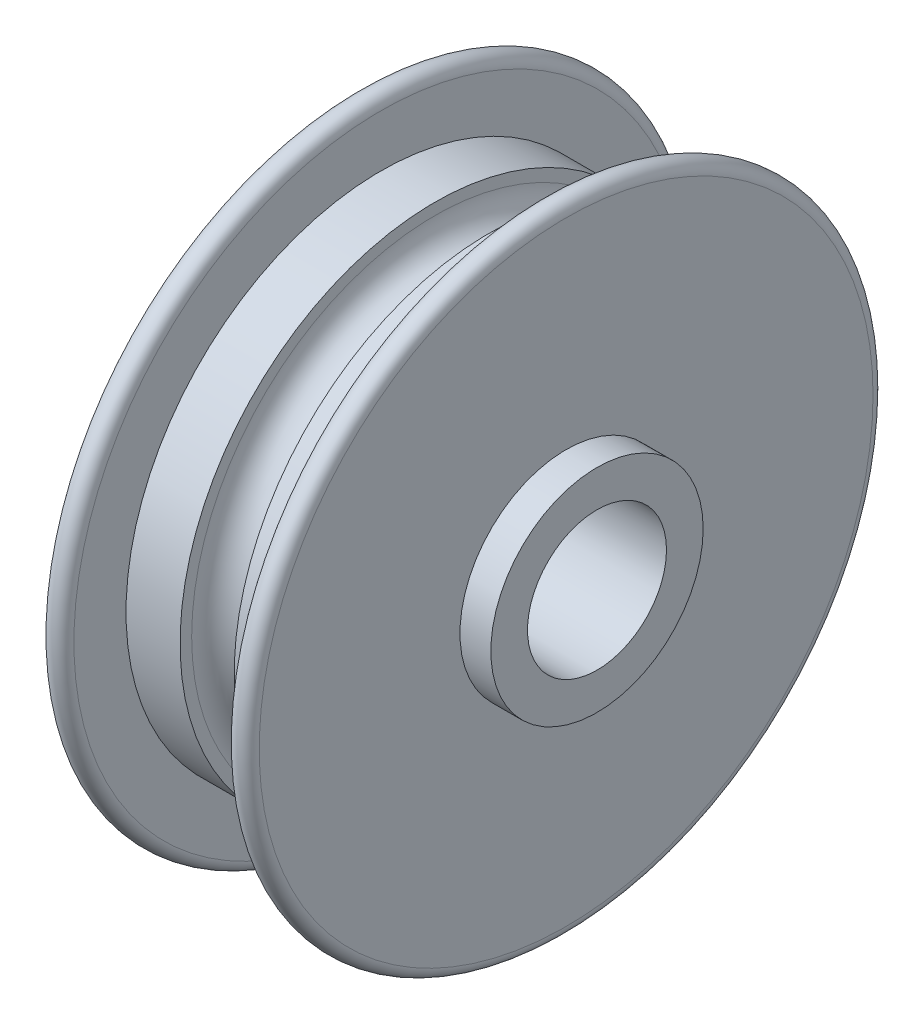
ISO-10303-21;
HEADER;
FILE_DESCRIPTION(('STEP AP214'),'2;1');
FILE_NAME('part.step','',(''),(''),'','','');
FILE_SCHEMA(('AUTOMOTIVE_DESIGN { 1 0 10303 214 1 1 1 1 }'));
ENDSEC;
DATA;
#1=APPLICATION_CONTEXT('core data for automotive mechanical design processes');
#2=APPLICATION_PROTOCOL_DEFINITION('international standard','automotive_design',2000,#1);
#3=PRODUCT_CONTEXT('',#1,'mechanical');
#4=PRODUCT('Part','Part','',(#3));
#5=PRODUCT_RELATED_PRODUCT_CATEGORY('part','',(#4));
#6=PRODUCT_DEFINITION_FORMATION('','',#4);
#7=PRODUCT_DEFINITION_CONTEXT('part definition',#1,'design');
#8=PRODUCT_DEFINITION('design','',#6,#7);
#9=PRODUCT_DEFINITION_SHAPE('','',#8);
#10=(LENGTH_UNIT() NAMED_UNIT(*) SI_UNIT(.MILLI.,.METRE.));
#11=(NAMED_UNIT(*) PLANE_ANGLE_UNIT() SI_UNIT($,.RADIAN.));
#12=(NAMED_UNIT(*) SI_UNIT($,.STERADIAN.) SOLID_ANGLE_UNIT());
#13=UNCERTAINTY_MEASURE_WITH_UNIT(LENGTH_MEASURE(1.E-05),#10,'distance_accuracy_value','');
#14=(GEOMETRIC_REPRESENTATION_CONTEXT(3) GLOBAL_UNCERTAINTY_ASSIGNED_CONTEXT((#13)) GLOBAL_UNIT_ASSIGNED_CONTEXT((#10,
#11,#12)) REPRESENTATION_CONTEXT('',''));
#15=CARTESIAN_POINT('',(0.,0.,0.));
#16=DIRECTION('',(0.,0.,1.));
#17=DIRECTION('',(1.,0.,0.));
#18=AXIS2_PLACEMENT_3D('',#15,#16,#17);
#19=CARTESIAN_POINT('',(-3.32408663179228,0.,0.));
#20=DIRECTION('',(1.,0.,0.));
#21=DIRECTION('',(0.,0.,-1.));
#22=AXIS2_PLACEMENT_3D('',#19,#20,#21);
#23=TOROIDAL_SURFACE('',#22,39.75,1.5);
#24=CARTESIAN_POINT('',(-1.82408663179228,0.,0.));
#25=DIRECTION('',(1.,0.,0.));
#26=DIRECTION('',(0.,0.,-1.));
#27=AXIS2_PLACEMENT_3D('',#24,#25,#26);
#28=CIRCLE('',#27,39.75);
#29=CARTESIAN_POINT('',(-1.82408663179228,0.,-39.75));
#30=VERTEX_POINT('',#29);
#31=EDGE_CURVE('E108',#30,#30,#28,.T.);
#32=ORIENTED_EDGE('',*,*,#31,.F.);
#33=EDGE_LOOP('',(#32));
#34=FACE_BOUND('',#33,.T.);
#35=CARTESIAN_POINT('',(-4.82408663179229,0.,0.));
#36=DIRECTION('',(1.,0.,0.));
#37=DIRECTION('',(0.,0.,-1.));
#38=AXIS2_PLACEMENT_3D('',#35,#36,#37);
#39=CIRCLE('',#38,39.75);
#40=CARTESIAN_POINT('',(-4.82408663179229,0.,-39.75));
#41=VERTEX_POINT('',#40);
#42=EDGE_CURVE('E10',#41,#41,#39,.T.);
#43=ORIENTED_EDGE('',*,*,#42,.T.);
#44=EDGE_LOOP('',(#43));
#45=FACE_BOUND('',#44,.T.);
#46=ADVANCED_FACE('F41',(#34,#45),#23,.T.);
#47=CARTESIAN_POINT('',(-4.82408663179228,0.,0.));
#48=DIRECTION('',(1.,0.,0.));
#49=DIRECTION('',(0.,0.,-1.));
#50=AXIS2_PLACEMENT_3D('',#47,#48,#49);
#51=PLANE('',#50);
#52=ORIENTED_EDGE('',*,*,#42,.F.);
#53=EDGE_LOOP('',(#52));
#54=FACE_BOUND('',#53,.T.);
#55=CARTESIAN_POINT('',(-4.82408663179228,0.,0.));
#56=DIRECTION('',(1.,0.,0.));
#57=DIRECTION('',(0.,0.,-1.));
#58=AXIS2_PLACEMENT_3D('',#55,#56,#57);
#59=CIRCLE('',#58,13.75);
#60=CARTESIAN_POINT('',(-4.82408663179228,0.,-13.75));
#61=VERTEX_POINT('',#60);
#62=EDGE_CURVE('E48',#61,#61,#59,.T.);
#63=ORIENTED_EDGE('',*,*,#62,.T.);
#64=EDGE_LOOP('',(#63));
#65=FACE_BOUND('',#64,.T.);
#66=ADVANCED_FACE('F116',(#54,#65),#51,.F.);
#67=CARTESIAN_POINT('',(-24.4615520047495,0.,0.));
#68=DIRECTION('',(1.,0.,0.));
#69=DIRECTION('',(0.,0.,-1.));
#70=AXIS2_PLACEMENT_3D('',#67,#68,#69);
#71=CYLINDRICAL_SURFACE('',#70,13.75);
#72=ORIENTED_EDGE('',*,*,#62,.F.);
#73=EDGE_LOOP('',(#72));
#74=FACE_BOUND('',#73,.T.);
#75=CARTESIAN_POINT('',(-8.82408663179228,0.,0.));
#76=DIRECTION('',(1.,0.,0.));
#77=DIRECTION('',(0.,0.,-1.));
#78=AXIS2_PLACEMENT_3D('',#75,#76,#77);
#79=CIRCLE('',#78,13.75);
#80=CARTESIAN_POINT('',(-8.82408663179228,0.,-13.75));
#81=VERTEX_POINT('',#80);
#82=EDGE_CURVE('E53',#81,#81,#79,.T.);
#83=ORIENTED_EDGE('',*,*,#82,.T.);
#84=EDGE_LOOP('',(#83));
#85=FACE_BOUND('',#84,.T.);
#86=ADVANCED_FACE('F120',(#74,#85),#71,.T.);
#87=CARTESIAN_POINT('',(-8.82408663179228,0.,0.));
#88=DIRECTION('',(-1.,0.,0.));
#89=DIRECTION('',(0.,0.,1.));
#90=AXIS2_PLACEMENT_3D('',#87,#88,#89);
#91=PLANE('',#90);
#92=CARTESIAN_POINT('',(-8.82408663179228,0.,0.));
#93=DIRECTION('',(1.,0.,0.));
#94=DIRECTION('',(0.,0.,-1.));
#95=AXIS2_PLACEMENT_3D('',#92,#93,#94);
#96=CIRCLE('',#95,8.99999999999999);
#97=CARTESIAN_POINT('',(-8.82408663179228,0.,-8.99999999999999));
#98=VERTEX_POINT('',#97);
#99=EDGE_CURVE('E58',#98,#98,#96,.T.);
#100=ORIENTED_EDGE('',*,*,#99,.T.);
#101=EDGE_LOOP('',(#100));
#102=FACE_BOUND('',#101,.T.);
#103=ORIENTED_EDGE('',*,*,#82,.F.);
#104=EDGE_LOOP('',(#103));
#105=FACE_BOUND('',#104,.T.);
#106=ADVANCED_FACE('F125',(#102,#105),#91,.T.);
#107=CARTESIAN_POINT('',(-24.4615520047495,0.,0.));
#108=DIRECTION('',(1.,0.,0.));
#109=DIRECTION('',(0.,0.,-1.));
#110=AXIS2_PLACEMENT_3D('',#107,#108,#109);
#111=CYLINDRICAL_SURFACE('',#110,9.);
#112=CARTESIAN_POINT('',(26.1759133682077,0.,0.));
#113=DIRECTION('',(1.,0.,0.));
#114=DIRECTION('',(0.,0.,-1.));
#115=AXIS2_PLACEMENT_3D('',#112,#113,#114);
#116=CIRCLE('',#115,9.);
#117=CARTESIAN_POINT('',(26.1759133682077,0.,-9.));
#118=VERTEX_POINT('',#117);
#119=EDGE_CURVE('E64',#118,#118,#116,.T.);
#120=ORIENTED_EDGE('',*,*,#119,.T.);
#121=EDGE_LOOP('',(#120));
#122=FACE_BOUND('',#121,.T.);
#123=ORIENTED_EDGE('',*,*,#99,.F.);
#124=EDGE_LOOP('',(#123));
#125=FACE_BOUND('',#124,.T.);
#126=ADVANCED_FACE('F131',(#122,#125),#111,.F.);
#127=CARTESIAN_POINT('',(26.1759133682077,0.,0.));
#128=DIRECTION('',(-1.,0.,0.));
#129=DIRECTION('',(0.,0.,1.));
#130=AXIS2_PLACEMENT_3D('',#127,#128,#129);
#131=PLANE('',#130);
#132=ORIENTED_EDGE('',*,*,#119,.F.);
#133=EDGE_LOOP('',(#132));
#134=FACE_BOUND('',#133,.T.);
#135=CARTESIAN_POINT('',(26.1759133682077,0.,0.));
#136=DIRECTION('',(1.,0.,0.));
#137=DIRECTION('',(0.,0.,-1.));
#138=AXIS2_PLACEMENT_3D('',#135,#136,#137);
#139=CIRCLE('',#138,13.75);
#140=CARTESIAN_POINT('',(26.1759133682077,0.,-13.75));
#141=VERTEX_POINT('',#140);
#142=EDGE_CURVE('E68',#141,#141,#139,.T.);
#143=ORIENTED_EDGE('',*,*,#142,.T.);
#144=EDGE_LOOP('',(#143));
#145=FACE_BOUND('',#144,.T.);
#146=ADVANCED_FACE('F135',(#134,#145),#131,.F.);
#147=CARTESIAN_POINT('',(-24.4615520047495,0.,0.));
#148=DIRECTION('',(1.,0.,0.));
#149=DIRECTION('',(0.,0.,-1.));
#150=AXIS2_PLACEMENT_3D('',#147,#148,#149);
#151=CYLINDRICAL_SURFACE('',#150,13.75);
#152=CARTESIAN_POINT('',(22.1759133682077,0.,0.));
#153=DIRECTION('',(1.,0.,0.));
#154=DIRECTION('',(0.,0.,-1.));
#155=AXIS2_PLACEMENT_3D('',#152,#153,#154);
#156=CIRCLE('',#155,13.75);
#157=CARTESIAN_POINT('',(22.1759133682077,0.,-13.75));
#158=VERTEX_POINT('',#157);
#159=EDGE_CURVE('E72',#158,#158,#156,.T.);
#160=ORIENTED_EDGE('',*,*,#159,.T.);
#161=EDGE_LOOP('',(#160));
#162=FACE_BOUND('',#161,.T.);
#163=ORIENTED_EDGE('',*,*,#142,.F.);
#164=EDGE_LOOP('',(#163));
#165=FACE_BOUND('',#164,.T.);
#166=ADVANCED_FACE('F139',(#162,#165),#151,.T.);
#167=CARTESIAN_POINT('',(22.1759133682077,0.,0.));
#168=DIRECTION('',(1.,0.,0.));
#169=DIRECTION('',(0.,0.,-1.));
#170=AXIS2_PLACEMENT_3D('',#167,#168,#169);
#171=PLANE('',#170);
#172=CARTESIAN_POINT('',(22.1759133682077,0.,0.));
#173=DIRECTION('',(1.,0.,0.));
#174=DIRECTION('',(0.,0.,-1.));
#175=AXIS2_PLACEMENT_3D('',#172,#173,#174);
#176=CIRCLE('',#175,39.75);
#177=CARTESIAN_POINT('',(22.1759133682077,0.,-39.75));
#178=VERTEX_POINT('',#177);
#179=EDGE_CURVE('E76',#178,#178,#176,.T.);
#180=ORIENTED_EDGE('',*,*,#179,.T.);
#181=EDGE_LOOP('',(#180));
#182=FACE_BOUND('',#181,.T.);
#183=ORIENTED_EDGE('',*,*,#159,.F.);
#184=EDGE_LOOP('',(#183));
#185=FACE_BOUND('',#184,.T.);
#186=ADVANCED_FACE('F143',(#182,#185),#171,.T.);
#187=CARTESIAN_POINT('',(20.6759133682077,0.,0.));
#188=DIRECTION('',(1.,0.,0.));
#189=DIRECTION('',(0.,0.,-1.));
#190=AXIS2_PLACEMENT_3D('',#187,#188,#189);
#191=TOROIDAL_SURFACE('',#190,39.75,1.5);
#192=CARTESIAN_POINT('',(19.1759133682077,0.,0.));
#193=DIRECTION('',(1.,0.,0.));
#194=DIRECTION('',(0.,0.,-1.));
#195=AXIS2_PLACEMENT_3D('',#192,#193,#194);
#196=CIRCLE('',#195,39.75);
#197=CARTESIAN_POINT('',(19.1759133682077,0.,-39.75));
#198=VERTEX_POINT('',#197);
#199=EDGE_CURVE('E80',#198,#198,#196,.T.);
#200=ORIENTED_EDGE('',*,*,#199,.T.);
#201=EDGE_LOOP('',(#200));
#202=FACE_BOUND('',#201,.T.);
#203=ORIENTED_EDGE('',*,*,#179,.F.);
#204=EDGE_LOOP('',(#203));
#205=FACE_BOUND('',#204,.T.);
#206=ADVANCED_FACE('F147',(#202,#205),#191,.T.);
#207=CARTESIAN_POINT('',(19.1759133682077,0.,0.));
#208=DIRECTION('',(-1.,0.,0.));
#209=DIRECTION('',(0.,0.,1.));
#210=AXIS2_PLACEMENT_3D('',#207,#208,#209);
#211=PLANE('',#210);
#212=CARTESIAN_POINT('',(19.1759133682077,0.,0.));
#213=DIRECTION('',(1.,0.,0.));
#214=DIRECTION('',(0.,0.,-1.));
#215=AXIS2_PLACEMENT_3D('',#212,#213,#214);
#216=CIRCLE('',#215,33.);
#217=CARTESIAN_POINT('',(19.1759133682077,0.,-33.));
#218=VERTEX_POINT('',#217);
#219=EDGE_CURVE('E84',#218,#218,#216,.T.);
#220=ORIENTED_EDGE('',*,*,#219,.T.);
#221=EDGE_LOOP('',(#220));
#222=FACE_BOUND('',#221,.T.);
#223=ORIENTED_EDGE('',*,*,#199,.F.);
#224=EDGE_LOOP('',(#223));
#225=FACE_BOUND('',#224,.T.);
#226=ADVANCED_FACE('F151',(#222,#225),#211,.T.);
#227=CARTESIAN_POINT('',(-24.4615520047495,0.,0.));
#228=DIRECTION('',(1.,0.,0.));
#229=DIRECTION('',(0.,0.,-1.));
#230=AXIS2_PLACEMENT_3D('',#227,#228,#229);
#231=CYLINDRICAL_SURFACE('',#230,33.);
#232=ORIENTED_EDGE('',*,*,#219,.F.);
#233=EDGE_LOOP('',(#232));
#234=FACE_BOUND('',#233,.T.);
#235=CARTESIAN_POINT('',(12.1759133682077,0.,0.));
#236=DIRECTION('',(1.,0.,0.));
#237=DIRECTION('',(0.,0.,-1.));
#238=AXIS2_PLACEMENT_3D('',#235,#236,#237);
#239=CIRCLE('',#238,33.);
#240=CARTESIAN_POINT('',(12.1759133682077,0.,-33.));
#241=VERTEX_POINT('',#240);
#242=EDGE_CURVE('E88',#241,#241,#239,.T.);
#243=ORIENTED_EDGE('',*,*,#242,.T.);
#244=EDGE_LOOP('',(#243));
#245=FACE_BOUND('',#244,.T.);
#246=ADVANCED_FACE('F155',(#234,#245),#231,.T.);
#247=CARTESIAN_POINT('',(12.1759133682077,0.,0.));
#248=DIRECTION('',(1.,0.,0.));
#249=DIRECTION('',(0.,0.,-1.));
#250=AXIS2_PLACEMENT_3D('',#247,#248,#249);
#251=PLANE('',#250);
#252=ORIENTED_EDGE('',*,*,#242,.F.);
#253=EDGE_LOOP('',(#252));
#254=FACE_BOUND('',#253,.T.);
#255=CARTESIAN_POINT('',(12.1759133682077,0.,0.));
#256=DIRECTION('',(1.,0.,0.));
#257=DIRECTION('',(0.,0.,-1.));
#258=AXIS2_PLACEMENT_3D('',#255,#256,#257);
#259=CIRCLE('',#258,31.5);
#260=CARTESIAN_POINT('',(12.1759133682077,0.,-31.5));
#261=VERTEX_POINT('',#260);
#262=EDGE_CURVE('E92',#261,#261,#259,.T.);
#263=ORIENTED_EDGE('',*,*,#262,.T.);
#264=EDGE_LOOP('',(#263));
#265=FACE_BOUND('',#264,.T.);
#266=ADVANCED_FACE('F159',(#254,#265),#251,.F.);
#267=CARTESIAN_POINT('',(8.67591336820773,0.,0.));
#268=DIRECTION('',(1.,0.,0.));
#269=DIRECTION('',(0.,0.,-1.));
#270=AXIS2_PLACEMENT_3D('',#267,#268,#269);
#271=TOROIDAL_SURFACE('',#270,31.5,3.5);
#272=ORIENTED_EDGE('',*,*,#262,.F.);
#273=EDGE_LOOP('',(#272));
#274=FACE_BOUND('',#273,.T.);
#275=CARTESIAN_POINT('',(5.17591336820772,0.,0.));
#276=DIRECTION('',(1.,0.,0.));
#277=DIRECTION('',(0.,0.,-1.));
#278=AXIS2_PLACEMENT_3D('',#275,#276,#277);
#279=CIRCLE('',#278,31.5);
#280=CARTESIAN_POINT('',(5.17591336820772,0.,-31.5));
#281=VERTEX_POINT('',#280);
#282=EDGE_CURVE('E96',#281,#281,#279,.T.);
#283=ORIENTED_EDGE('',*,*,#282,.T.);
#284=EDGE_LOOP('',(#283));
#285=FACE_BOUND('',#284,.T.);
#286=ADVANCED_FACE('F163',(#274,#285),#271,.F.);
#287=CARTESIAN_POINT('',(5.17591336820772,0.,0.));
#288=DIRECTION('',(-1.,0.,0.));
#289=DIRECTION('',(0.,0.,1.));
#290=AXIS2_PLACEMENT_3D('',#287,#288,#289);
#291=PLANE('',#290);
#292=ORIENTED_EDGE('',*,*,#282,.F.);
#293=EDGE_LOOP('',(#292));
#294=FACE_BOUND('',#293,.T.);
#295=CARTESIAN_POINT('',(5.17591336820772,0.,0.));
#296=DIRECTION('',(1.,0.,0.));
#297=DIRECTION('',(0.,0.,-1.));
#298=AXIS2_PLACEMENT_3D('',#295,#296,#297);
#299=CIRCLE('',#298,33.);
#300=CARTESIAN_POINT('',(5.17591336820772,0.,-33.));
#301=VERTEX_POINT('',#300);
#302=EDGE_CURVE('E100',#301,#301,#299,.T.);
#303=ORIENTED_EDGE('',*,*,#302,.T.);
#304=EDGE_LOOP('',(#303));
#305=FACE_BOUND('',#304,.T.);
#306=ADVANCED_FACE('F167',(#294,#305),#291,.F.);
#307=CARTESIAN_POINT('',(-24.4615520047495,0.,0.));
#308=DIRECTION('',(1.,0.,0.));
#309=DIRECTION('',(0.,0.,-1.));
#310=AXIS2_PLACEMENT_3D('',#307,#308,#309);
#311=CYLINDRICAL_SURFACE('',#310,33.);
#312=ORIENTED_EDGE('',*,*,#302,.F.);
#313=EDGE_LOOP('',(#312));
#314=FACE_BOUND('',#313,.T.);
#315=CARTESIAN_POINT('',(-1.82408663179228,0.,0.));
#316=DIRECTION('',(1.,0.,0.));
#317=DIRECTION('',(0.,0.,-1.));
#318=AXIS2_PLACEMENT_3D('',#315,#316,#317);
#319=CIRCLE('',#318,33.);
#320=CARTESIAN_POINT('',(-1.82408663179228,0.,-33.));
#321=VERTEX_POINT('',#320);
#322=EDGE_CURVE('E104',#321,#321,#319,.T.);
#323=ORIENTED_EDGE('',*,*,#322,.T.);
#324=EDGE_LOOP('',(#323));
#325=FACE_BOUND('',#324,.T.);
#326=ADVANCED_FACE('F171',(#314,#325),#311,.T.);
#327=CARTESIAN_POINT('',(-1.82408663179228,0.,0.));
#328=DIRECTION('',(-1.,0.,0.));
#329=DIRECTION('',(0.,0.,1.));
#330=AXIS2_PLACEMENT_3D('',#327,#328,#329);
#331=PLANE('',#330);
#332=ORIENTED_EDGE('',*,*,#322,.F.);
#333=EDGE_LOOP('',(#332));
#334=FACE_BOUND('',#333,.T.);
#335=ORIENTED_EDGE('',*,*,#31,.T.);
#336=EDGE_LOOP('',(#335));
#337=FACE_BOUND('',#336,.T.);
#338=ADVANCED_FACE('F113',(#334,#337),#331,.F.);
#339=CLOSED_SHELL('',(#46,#66,#86,#106,#126,#146,#166,#186,#206,#226,#246,#266,#286,#306,#326,#338));
#340=MANIFOLD_SOLID_BREP('B2',#339);
#341=ADVANCED_BREP_SHAPE_REPRESENTATION('',(#18,#340),#14);
#342=SHAPE_DEFINITION_REPRESENTATION(#9,#341);
ENDSEC;
END-ISO-10303-21;
